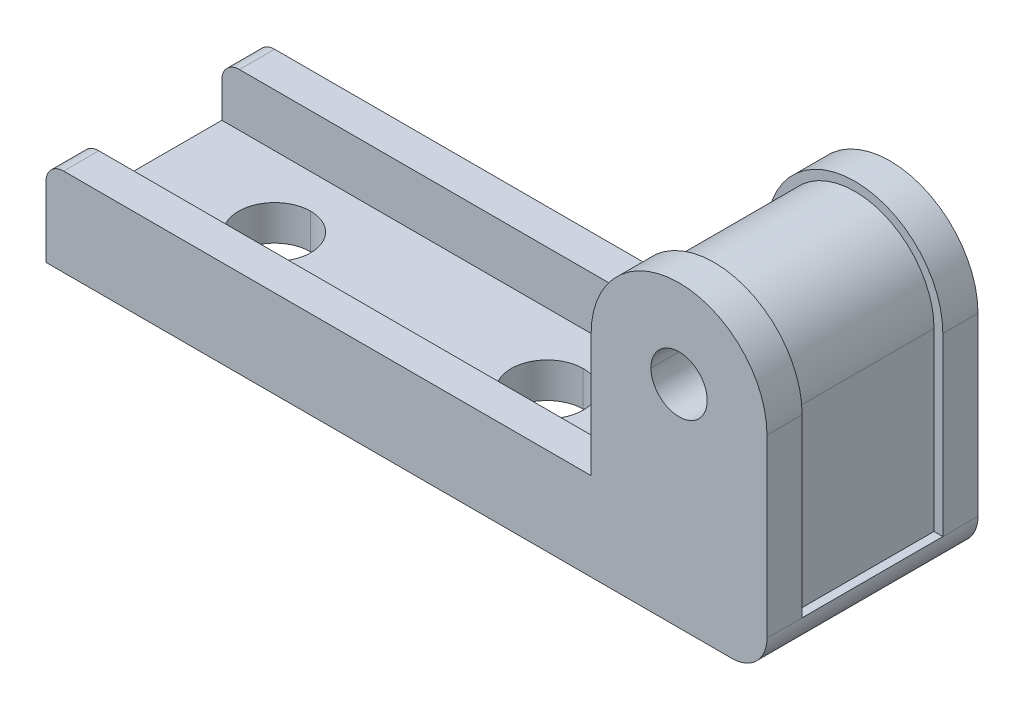
ISO-10303-21;
HEADER;
FILE_DESCRIPTION(('STEP AP214'),'2;1');
FILE_NAME('part.step','',(''),(''),'','','');
FILE_SCHEMA(('AUTOMOTIVE_DESIGN { 1 0 10303 214 1 1 1 1 }'));
ENDSEC;
DATA;
#1=APPLICATION_CONTEXT('core data for automotive mechanical design processes');
#2=APPLICATION_PROTOCOL_DEFINITION('international standard','automotive_design',2000,#1);
#3=PRODUCT_CONTEXT('',#1,'mechanical');
#4=PRODUCT('Part','Part','',(#3));
#5=PRODUCT_RELATED_PRODUCT_CATEGORY('part','',(#4));
#6=PRODUCT_DEFINITION_FORMATION('','',#4);
#7=PRODUCT_DEFINITION_CONTEXT('part definition',#1,'design');
#8=PRODUCT_DEFINITION('design','',#6,#7);
#9=PRODUCT_DEFINITION_SHAPE('','',#8);
#10=(LENGTH_UNIT() NAMED_UNIT(*) SI_UNIT(.MILLI.,.METRE.));
#11=(NAMED_UNIT(*) PLANE_ANGLE_UNIT() SI_UNIT($,.RADIAN.));
#12=(NAMED_UNIT(*) SI_UNIT($,.STERADIAN.) SOLID_ANGLE_UNIT());
#13=UNCERTAINTY_MEASURE_WITH_UNIT(LENGTH_MEASURE(1.E-05),#10,'distance_accuracy_value','');
#14=(GEOMETRIC_REPRESENTATION_CONTEXT(3) GLOBAL_UNCERTAINTY_ASSIGNED_CONTEXT((#13)) GLOBAL_UNIT_ASSIGNED_CONTEXT((#10,
#11,#12)) REPRESENTATION_CONTEXT('',''));
#15=CARTESIAN_POINT('',(0.,0.,0.));
#16=DIRECTION('',(0.,0.,1.));
#17=DIRECTION('',(1.,0.,0.));
#18=AXIS2_PLACEMENT_3D('',#15,#16,#17);
#19=CARTESIAN_POINT('',(-35.0000000000007,-7.99999999999931,6.));
#20=DIRECTION('',(0.,0.,-1.));
#21=DIRECTION('',(0.707106781186164,-0.707106781186931,0.));
#22=AXIS2_PLACEMENT_3D('',#19,#20,#21);
#23=CYLINDRICAL_SURFACE('',#22,0.999999999999313);
#24=CARTESIAN_POINT('',(-35.0000000000007,-7.99999999999931,-4.));
#25=DIRECTION('',(0.,0.,1.));
#26=DIRECTION('',(1.,0.,0.));
#27=AXIS2_PLACEMENT_3D('',#24,#25,#26);
#28=CIRCLE('',#27,0.999999999999313);
#29=CARTESIAN_POINT('',(-35.,-7.,-4.));
#30=VERTEX_POINT('',#29);
#31=CARTESIAN_POINT('',(-36.,-8.,-4.));
#32=VERTEX_POINT('',#31);
#33=EDGE_CURVE('E10',#30,#32,#28,.T.);
#34=ORIENTED_EDGE('',*,*,#33,.F.);
#35=DIRECTION('',(0.,0.,-1.));
#36=VECTOR('',#35,1.);
#37=CARTESIAN_POINT('',(-35.,-7.,6.));
#38=LINE('',#37,#36);
#39=CARTESIAN_POINT('',(-35.,-7.,-6.));
#40=VERTEX_POINT('',#39);
#41=EDGE_CURVE('E24',#30,#40,#38,.T.);
#42=ORIENTED_EDGE('',*,*,#41,.T.);
#43=CARTESIAN_POINT('',(-35.0000000000007,-7.99999999999931,-6.));
#44=DIRECTION('',(0.,0.,1.));
#45=DIRECTION('',(1.,0.,0.));
#46=AXIS2_PLACEMENT_3D('',#43,#44,#45);
#47=CIRCLE('',#46,0.999999999999313);
#48=CARTESIAN_POINT('',(-36.,-8.,-6.));
#49=VERTEX_POINT('',#48);
#50=EDGE_CURVE('E509',#40,#49,#47,.T.);
#51=ORIENTED_EDGE('',*,*,#50,.T.);
#52=DIRECTION('',(0.,0.,-1.));
#53=VECTOR('',#52,1.);
#54=CARTESIAN_POINT('',(-36.,-8.,6.));
#55=LINE('',#54,#53);
#56=EDGE_CURVE('E504',#32,#49,#55,.T.);
#57=ORIENTED_EDGE('',*,*,#56,.F.);
#58=EDGE_LOOP('',(#34,#42,#51,#57));
#59=FACE_BOUND('',#58,.T.);
#60=ADVANCED_FACE('F16',(#59),#23,.T.);
#61=CARTESIAN_POINT('',(-36.,-8.,6.));
#62=DIRECTION('',(1.,0.,0.));
#63=DIRECTION('',(0.,0.,-1.));
#64=AXIS2_PLACEMENT_3D('',#61,#62,#63);
#65=PLANE('',#64);
#66=DIRECTION('',(0.,0.,-1.));
#67=VECTOR('',#66,1.);
#68=CARTESIAN_POINT('',(-36.,-8.,6.));
#69=LINE('',#68,#67);
#70=CARTESIAN_POINT('',(-36.,-8.,6.));
#71=VERTEX_POINT('',#70);
#72=CARTESIAN_POINT('',(-36.,-8.,4.));
#73=VERTEX_POINT('',#72);
#74=EDGE_CURVE('E500',#71,#73,#69,.T.);
#75=ORIENTED_EDGE('',*,*,#74,.T.);
#76=DIRECTION('',(0.,-1.,0.));
#77=VECTOR('',#76,1.);
#78=CARTESIAN_POINT('',(-36.,-8.,4.));
#79=LINE('',#78,#77);
#80=CARTESIAN_POINT('',(-36.,-10.,4.));
#81=VERTEX_POINT('',#80);
#82=EDGE_CURVE('E496',#73,#81,#79,.T.);
#83=ORIENTED_EDGE('',*,*,#82,.T.);
#84=DIRECTION('',(0.,0.,1.));
#85=VECTOR('',#84,1.);
#86=CARTESIAN_POINT('',(-36.,-10.,6.));
#87=LINE('',#86,#85);
#88=CARTESIAN_POINT('',(-36.,-10.,-4.));
#89=VERTEX_POINT('',#88);
#90=EDGE_CURVE('E491',#89,#81,#87,.T.);
#91=ORIENTED_EDGE('',*,*,#90,.F.);
#92=DIRECTION('',(0.,-1.,0.));
#93=VECTOR('',#92,1.);
#94=CARTESIAN_POINT('',(-36.,-8.,-4.));
#95=LINE('',#94,#93);
#96=EDGE_CURVE('E486',#32,#89,#95,.T.);
#97=ORIENTED_EDGE('',*,*,#96,.F.);
#98=ORIENTED_EDGE('',*,*,#56,.T.);
#99=DIRECTION('',(0.,-1.,0.));
#100=VECTOR('',#99,1.);
#101=CARTESIAN_POINT('',(-36.,-8.,-6.));
#102=LINE('',#101,#100);
#103=CARTESIAN_POINT('',(-36.,-12.,-6.));
#104=VERTEX_POINT('',#103);
#105=EDGE_CURVE('E482',#49,#104,#102,.T.);
#106=ORIENTED_EDGE('',*,*,#105,.T.);
#107=DIRECTION('',(0.,0.,-1.));
#108=VECTOR('',#107,1.);
#109=CARTESIAN_POINT('',(-36.,-12.,6.));
#110=LINE('',#109,#108);
#111=CARTESIAN_POINT('',(-36.,-12.,6.));
#112=VERTEX_POINT('',#111);
#113=EDGE_CURVE('E477',#112,#104,#110,.T.);
#114=ORIENTED_EDGE('',*,*,#113,.F.);
#115=DIRECTION('',(0.,-1.,0.));
#116=VECTOR('',#115,1.);
#117=CARTESIAN_POINT('',(-36.,-8.,6.));
#118=LINE('',#117,#116);
#119=EDGE_CURVE('E472',#71,#112,#118,.T.);
#120=ORIENTED_EDGE('',*,*,#119,.F.);
#121=EDGE_LOOP('',(#75,#83,#91,#97,#98,#106,#114,#120));
#122=FACE_BOUND('',#121,.T.);
#123=ADVANCED_FACE('F525',(#122),#65,.F.);
#124=CARTESIAN_POINT('',(-35.0000000000007,-7.99999999999931,6.));
#125=DIRECTION('',(0.,0.,1.));
#126=DIRECTION('',(1.,0.,0.));
#127=AXIS2_PLACEMENT_3D('',#124,#125,#126);
#128=PLANE('',#127);
#129=CARTESIAN_POINT('',(0.,0.,6.));
#130=DIRECTION('',(0.,0.,1.));
#131=DIRECTION('',(1.,0.,0.));
#132=AXIS2_PLACEMENT_3D('',#129,#130,#131);
#133=CIRCLE('',#132,1.6);
#134=CARTESIAN_POINT('',(-1.6,0.,6.));
#135=VERTEX_POINT('',#134);
#136=CARTESIAN_POINT('',(1.6,0.,6.));
#137=VERTEX_POINT('',#136);
#138=EDGE_CURVE('E467',#135,#137,#133,.T.);
#139=ORIENTED_EDGE('',*,*,#138,.F.);
#140=CARTESIAN_POINT('',(0.,0.,6.));
#141=DIRECTION('',(0.,0.,1.));
#142=DIRECTION('',(1.,0.,0.));
#143=AXIS2_PLACEMENT_3D('',#140,#141,#142);
#144=CIRCLE('',#143,1.6);
#145=EDGE_CURVE('E462',#137,#135,#144,.T.);
#146=ORIENTED_EDGE('',*,*,#145,.F.);
#147=EDGE_LOOP('',(#139,#146));
#148=FACE_BOUND('',#147,.T.);
#149=CARTESIAN_POINT('',(-35.0000000000007,-7.99999999999931,6.));
#150=DIRECTION('',(0.,0.,1.));
#151=DIRECTION('',(1.,0.,0.));
#152=AXIS2_PLACEMENT_3D('',#149,#150,#151);
#153=CIRCLE('',#152,0.999999999999313);
#154=CARTESIAN_POINT('',(-35.,-7.,6.));
#155=VERTEX_POINT('',#154);
#156=EDGE_CURVE('E457',#155,#71,#153,.T.);
#157=ORIENTED_EDGE('',*,*,#156,.T.);
#158=ORIENTED_EDGE('',*,*,#119,.T.);
#159=DIRECTION('',(1.,0.,0.));
#160=VECTOR('',#159,1.);
#161=CARTESIAN_POINT('',(-36.,-12.,6.));
#162=LINE('',#161,#160);
#163=CARTESIAN_POINT('',(3.,-12.,6.));
#164=VERTEX_POINT('',#163);
#165=EDGE_CURVE('E453',#112,#164,#162,.T.);
#166=ORIENTED_EDGE('',*,*,#165,.T.);
#167=CARTESIAN_POINT('',(2.99999999999985,-9.99999999999985,6.));
#168=DIRECTION('',(0.,0.,1.));
#169=DIRECTION('',(1.,0.,0.));
#170=AXIS2_PLACEMENT_3D('',#167,#168,#169);
#171=CIRCLE('',#170,2.00000000000015);
#172=CARTESIAN_POINT('',(5.,-10.,6.));
#173=VERTEX_POINT('',#172);
#174=EDGE_CURVE('E449',#164,#173,#171,.T.);
#175=ORIENTED_EDGE('',*,*,#174,.T.);
#176=DIRECTION('',(0.,1.,0.));
#177=VECTOR('',#176,1.);
#178=CARTESIAN_POINT('',(5.,-10.,6.));
#179=LINE('',#178,#177);
#180=CARTESIAN_POINT('',(5.,0.,6.));
#181=VERTEX_POINT('',#180);
#182=EDGE_CURVE('E445',#173,#181,#179,.T.);
#183=ORIENTED_EDGE('',*,*,#182,.T.);
#184=CARTESIAN_POINT('',(0.,0.,6.));
#185=DIRECTION('',(0.,0.,1.));
#186=DIRECTION('',(1.,0.,0.));
#187=AXIS2_PLACEMENT_3D('',#184,#185,#186);
#188=CIRCLE('',#187,5.);
#189=CARTESIAN_POINT('',(-5.,0.,6.));
#190=VERTEX_POINT('',#189);
#191=EDGE_CURVE('E441',#181,#190,#188,.T.);
#192=ORIENTED_EDGE('',*,*,#191,.T.);
#193=DIRECTION('',(0.,-1.,0.));
#194=VECTOR('',#193,1.);
#195=CARTESIAN_POINT('',(-5.,0.,6.));
#196=LINE('',#195,#194);
#197=CARTESIAN_POINT('',(-5.,-7.,6.));
#198=VERTEX_POINT('',#197);
#199=EDGE_CURVE('E437',#190,#198,#196,.T.);
#200=ORIENTED_EDGE('',*,*,#199,.T.);
#201=DIRECTION('',(-1.,0.,0.));
#202=VECTOR('',#201,1.);
#203=CARTESIAN_POINT('',(-5.,-7.,6.));
#204=LINE('',#203,#202);
#205=EDGE_CURVE('E433',#198,#155,#204,.T.);
#206=ORIENTED_EDGE('',*,*,#205,.T.);
#207=EDGE_LOOP('',(#157,#158,#166,#175,#183,#192,#200,#206));
#208=FACE_BOUND('',#207,.T.);
#209=ADVANCED_FACE('F555',(#148,#208),#128,.T.);
#210=CARTESIAN_POINT('',(-5.,-7.,6.));
#211=DIRECTION('',(0.,-1.,0.));
#212=DIRECTION('',(0.,0.,-1.));
#213=AXIS2_PLACEMENT_3D('',#210,#211,#212);
#214=PLANE('',#213);
#215=DIRECTION('',(0.,0.,-1.));
#216=VECTOR('',#215,1.);
#217=CARTESIAN_POINT('',(-5.,-7.,6.));
#218=LINE('',#217,#216);
#219=CARTESIAN_POINT('',(-5.,-7.,4.));
#220=VERTEX_POINT('',#219);
#221=EDGE_CURVE('E429',#198,#220,#218,.T.);
#222=ORIENTED_EDGE('',*,*,#221,.T.);
#223=DIRECTION('',(-1.,0.,0.));
#224=VECTOR('',#223,1.);
#225=CARTESIAN_POINT('',(-5.,-7.,4.));
#226=LINE('',#225,#224);
#227=CARTESIAN_POINT('',(-35.,-7.,4.));
#228=VERTEX_POINT('',#227);
#229=EDGE_CURVE('E425',#220,#228,#226,.T.);
#230=ORIENTED_EDGE('',*,*,#229,.T.);
#231=DIRECTION('',(0.,0.,-1.));
#232=VECTOR('',#231,1.);
#233=CARTESIAN_POINT('',(-35.,-7.,6.));
#234=LINE('',#233,#232);
#235=EDGE_CURVE('E420',#155,#228,#234,.T.);
#236=ORIENTED_EDGE('',*,*,#235,.F.);
#237=ORIENTED_EDGE('',*,*,#205,.F.);
#238=EDGE_LOOP('',(#222,#230,#236,#237));
#239=FACE_BOUND('',#238,.T.);
#240=ADVANCED_FACE('F597',(#239),#214,.F.);
#241=CARTESIAN_POINT('',(-35.0000000000007,-7.99999999999931,6.));
#242=DIRECTION('',(0.,0.,-1.));
#243=DIRECTION('',(0.707106781186164,-0.707106781186931,0.));
#244=AXIS2_PLACEMENT_3D('',#241,#242,#243);
#245=CYLINDRICAL_SURFACE('',#244,0.999999999999313);
#246=ORIENTED_EDGE('',*,*,#235,.T.);
#247=CARTESIAN_POINT('',(-35.0000000000007,-7.99999999999931,4.));
#248=DIRECTION('',(0.,0.,1.));
#249=DIRECTION('',(1.,0.,0.));
#250=AXIS2_PLACEMENT_3D('',#247,#248,#249);
#251=CIRCLE('',#250,0.999999999999313);
#252=EDGE_CURVE('E415',#228,#73,#251,.T.);
#253=ORIENTED_EDGE('',*,*,#252,.T.);
#254=ORIENTED_EDGE('',*,*,#74,.F.);
#255=ORIENTED_EDGE('',*,*,#156,.F.);
#256=EDGE_LOOP('',(#246,#253,#254,#255));
#257=FACE_BOUND('',#256,.T.);
#258=ADVANCED_FACE('F559',(#257),#245,.T.);
#259=CARTESIAN_POINT('',(0.,0.,4.));
#260=DIRECTION('',(0.,0.,1.));
#261=DIRECTION('',(1.,0.,0.));
#262=AXIS2_PLACEMENT_3D('',#259,#260,#261);
#263=PLANE('',#262);
#264=ORIENTED_EDGE('',*,*,#252,.F.);
#265=ORIENTED_EDGE('',*,*,#229,.F.);
#266=DIRECTION('',(0.,-1.,0.));
#267=VECTOR('',#266,1.);
#268=CARTESIAN_POINT('',(-5.,0.,4.));
#269=LINE('',#268,#267);
#270=CARTESIAN_POINT('',(-5.,0.,4.));
#271=VERTEX_POINT('',#270);
#272=EDGE_CURVE('E410',#271,#220,#269,.T.);
#273=ORIENTED_EDGE('',*,*,#272,.F.);
#274=CARTESIAN_POINT('',(0.,0.,4.));
#275=DIRECTION('',(0.,0.,1.));
#276=DIRECTION('',(1.,0.,0.));
#277=AXIS2_PLACEMENT_3D('',#274,#275,#276);
#278=CIRCLE('',#277,5.);
#279=CARTESIAN_POINT('',(5.,0.,4.));
#280=VERTEX_POINT('',#279);
#281=EDGE_CURVE('E405',#280,#271,#278,.T.);
#282=ORIENTED_EDGE('',*,*,#281,.F.);
#283=DIRECTION('',(0.,1.,0.));
#284=VECTOR('',#283,1.);
#285=CARTESIAN_POINT('',(5.,-10.,4.));
#286=LINE('',#285,#284);
#287=CARTESIAN_POINT('',(5.,-10.,4.));
#288=VERTEX_POINT('',#287);
#289=EDGE_CURVE('E400',#288,#280,#286,.T.);
#290=ORIENTED_EDGE('',*,*,#289,.F.);
#291=DIRECTION('',(1.,0.,0.));
#292=VECTOR('',#291,1.);
#293=CARTESIAN_POINT('',(4.5,-10.,4.));
#294=LINE('',#293,#292);
#295=CARTESIAN_POINT('',(4.5,-10.,4.));
#296=VERTEX_POINT('',#295);
#297=EDGE_CURVE('E395',#296,#288,#294,.T.);
#298=ORIENTED_EDGE('',*,*,#297,.F.);
#299=DIRECTION('',(0.,-1.,0.));
#300=VECTOR('',#299,1.);
#301=CARTESIAN_POINT('',(4.5,0.,4.));
#302=LINE('',#301,#300);
#303=CARTESIAN_POINT('',(4.5,0.,4.));
#304=VERTEX_POINT('',#303);
#305=EDGE_CURVE('E390',#304,#296,#302,.T.);
#306=ORIENTED_EDGE('',*,*,#305,.F.);
#307=CARTESIAN_POINT('',(0.,0.,4.));
#308=DIRECTION('',(0.,0.,1.));
#309=DIRECTION('',(1.,0.,0.));
#310=AXIS2_PLACEMENT_3D('',#307,#308,#309);
#311=CIRCLE('',#310,4.5);
#312=CARTESIAN_POINT('',(-4.5,0.,4.));
#313=VERTEX_POINT('',#312);
#314=EDGE_CURVE('E386',#304,#313,#311,.T.);
#315=ORIENTED_EDGE('',*,*,#314,.T.);
#316=DIRECTION('',(0.,1.,0.));
#317=VECTOR('',#316,1.);
#318=CARTESIAN_POINT('',(-4.5,-10.,4.));
#319=LINE('',#318,#317);
#320=CARTESIAN_POINT('',(-4.5,-10.,4.));
#321=VERTEX_POINT('',#320);
#322=EDGE_CURVE('E381',#321,#313,#319,.T.);
#323=ORIENTED_EDGE('',*,*,#322,.F.);
#324=DIRECTION('',(1.,0.,0.));
#325=VECTOR('',#324,1.);
#326=CARTESIAN_POINT('',(-44.5,-10.,4.));
#327=LINE('',#326,#325);
#328=EDGE_CURVE('E376',#81,#321,#327,.T.);
#329=ORIENTED_EDGE('',*,*,#328,.F.);
#330=ORIENTED_EDGE('',*,*,#82,.F.);
#331=EDGE_LOOP('',(#264,#265,#273,#282,#290,#298,#306,#315,#323,#329,#330));
#332=FACE_BOUND('',#331,.T.);
#333=ADVANCED_FACE('F565',(#332),#263,.F.);
#334=CARTESIAN_POINT('',(-44.5,-10.,4.));
#335=DIRECTION('',(0.,1.,0.));
#336=DIRECTION('',(0.,0.,1.));
#337=AXIS2_PLACEMENT_3D('',#334,#335,#336);
#338=PLANE('',#337);
#339=CARTESIAN_POINT('',(-29.,-10.,0.));
#340=DIRECTION('',(0.,1.,0.));
#341=DIRECTION('',(1.,0.,0.));
#342=AXIS2_PLACEMENT_3D('',#339,#340,#341);
#343=CIRCLE('',#342,2.05);
#344=CARTESIAN_POINT('',(-29.,-10.,-2.05));
#345=VERTEX_POINT('',#344);
#346=CARTESIAN_POINT('',(-29.,-10.,2.05));
#347=VERTEX_POINT('',#346);
#348=EDGE_CURVE('E371',#345,#347,#343,.T.);
#349=ORIENTED_EDGE('',*,*,#348,.F.);
#350=CARTESIAN_POINT('',(-29.,-10.,0.));
#351=DIRECTION('',(0.,1.,0.));
#352=DIRECTION('',(0.,0.,1.));
#353=AXIS2_PLACEMENT_3D('',#350,#351,#352);
#354=CIRCLE('',#353,2.05);
#355=EDGE_CURVE('E366',#347,#345,#354,.T.);
#356=ORIENTED_EDGE('',*,*,#355,.F.);
#357=EDGE_LOOP('',(#349,#356));
#358=FACE_BOUND('',#357,.T.);
#359=CARTESIAN_POINT('',(-13.5,-10.,0.));
#360=DIRECTION('',(0.,1.,0.));
#361=DIRECTION('',(1.,0.,0.));
#362=AXIS2_PLACEMENT_3D('',#359,#360,#361);
#363=CIRCLE('',#362,2.05);
#364=CARTESIAN_POINT('',(-13.5,-10.,-2.05));
#365=VERTEX_POINT('',#364);
#366=CARTESIAN_POINT('',(-13.5,-10.,2.05));
#367=VERTEX_POINT('',#366);
#368=EDGE_CURVE('E362',#365,#367,#363,.T.);
#369=ORIENTED_EDGE('',*,*,#368,.F.);
#370=CARTESIAN_POINT('',(-13.5,-10.,0.));
#371=DIRECTION('',(0.,1.,0.));
#372=DIRECTION('',(0.,0.,1.));
#373=AXIS2_PLACEMENT_3D('',#370,#371,#372);
#374=CIRCLE('',#373,2.05);
#375=EDGE_CURVE('E198',#367,#365,#374,.T.);
#376=ORIENTED_EDGE('',*,*,#375,.F.);
#377=EDGE_LOOP('',(#369,#376));
#378=FACE_BOUND('',#377,.T.);
#379=ORIENTED_EDGE('',*,*,#90,.T.);
#380=ORIENTED_EDGE('',*,*,#328,.T.);
#381=DIRECTION('',(0.,0.,-1.));
#382=VECTOR('',#381,1.);
#383=CARTESIAN_POINT('',(-4.5,-10.,4.));
#384=LINE('',#383,#382);
#385=CARTESIAN_POINT('',(-4.5,-10.,-4.));
#386=VERTEX_POINT('',#385);
#387=EDGE_CURVE('E355',#321,#386,#384,.T.);
#388=ORIENTED_EDGE('',*,*,#387,.T.);
#389=DIRECTION('',(1.,0.,0.));
#390=VECTOR('',#389,1.);
#391=CARTESIAN_POINT('',(-44.5,-10.,-4.));
#392=LINE('',#391,#390);
#393=EDGE_CURVE('E350',#89,#386,#392,.T.);
#394=ORIENTED_EDGE('',*,*,#393,.F.);
#395=EDGE_LOOP('',(#379,#380,#388,#394));
#396=FACE_BOUND('',#395,.T.);
#397=ADVANCED_FACE('F568',(#358,#378,#396),#338,.T.);
#398=CARTESIAN_POINT('',(0.,0.,-4.));
#399=DIRECTION('',(0.,0.,1.));
#400=DIRECTION('',(1.,0.,0.));
#401=AXIS2_PLACEMENT_3D('',#398,#399,#400);
#402=PLANE('',#401);
#403=ORIENTED_EDGE('',*,*,#96,.T.);
#404=ORIENTED_EDGE('',*,*,#393,.T.);
#405=DIRECTION('',(0.,1.,0.));
#406=VECTOR('',#405,1.);
#407=CARTESIAN_POINT('',(-4.5,-10.,-4.));
#408=LINE('',#407,#406);
#409=CARTESIAN_POINT('',(-4.5,0.,-4.));
#410=VERTEX_POINT('',#409);
#411=EDGE_CURVE('E346',#386,#410,#408,.T.);
#412=ORIENTED_EDGE('',*,*,#411,.T.);
#413=CARTESIAN_POINT('',(0.,0.,-4.));
#414=DIRECTION('',(0.,0.,1.));
#415=DIRECTION('',(1.,0.,0.));
#416=AXIS2_PLACEMENT_3D('',#413,#414,#415);
#417=CIRCLE('',#416,4.5);
#418=CARTESIAN_POINT('',(4.5,0.,-4.));
#419=VERTEX_POINT('',#418);
#420=EDGE_CURVE('E341',#419,#410,#417,.T.);
#421=ORIENTED_EDGE('',*,*,#420,.F.);
#422=DIRECTION('',(0.,-1.,0.));
#423=VECTOR('',#422,1.);
#424=CARTESIAN_POINT('',(4.5,0.,-4.));
#425=LINE('',#424,#423);
#426=CARTESIAN_POINT('',(4.5,-10.,-4.));
#427=VERTEX_POINT('',#426);
#428=EDGE_CURVE('E337',#419,#427,#425,.T.);
#429=ORIENTED_EDGE('',*,*,#428,.T.);
#430=DIRECTION('',(1.,0.,0.));
#431=VECTOR('',#430,1.);
#432=CARTESIAN_POINT('',(4.5,-10.,-4.));
#433=LINE('',#432,#431);
#434=CARTESIAN_POINT('',(5.,-10.,-4.));
#435=VERTEX_POINT('',#434);
#436=EDGE_CURVE('E333',#427,#435,#433,.T.);
#437=ORIENTED_EDGE('',*,*,#436,.T.);
#438=DIRECTION('',(0.,1.,0.));
#439=VECTOR('',#438,1.);
#440=CARTESIAN_POINT('',(5.,-10.,-4.));
#441=LINE('',#440,#439);
#442=CARTESIAN_POINT('',(5.,0.,-4.));
#443=VERTEX_POINT('',#442);
#444=EDGE_CURVE('E329',#435,#443,#441,.T.);
#445=ORIENTED_EDGE('',*,*,#444,.T.);
#446=CARTESIAN_POINT('',(0.,0.,-4.));
#447=DIRECTION('',(0.,0.,1.));
#448=DIRECTION('',(1.,0.,0.));
#449=AXIS2_PLACEMENT_3D('',#446,#447,#448);
#450=CIRCLE('',#449,5.);
#451=CARTESIAN_POINT('',(-5.,0.,-4.));
#452=VERTEX_POINT('',#451);
#453=EDGE_CURVE('E325',#443,#452,#450,.T.);
#454=ORIENTED_EDGE('',*,*,#453,.T.);
#455=DIRECTION('',(0.,-1.,0.));
#456=VECTOR('',#455,1.);
#457=CARTESIAN_POINT('',(-5.,0.,-4.));
#458=LINE('',#457,#456);
#459=CARTESIAN_POINT('',(-5.,-7.,-4.));
#460=VERTEX_POINT('',#459);
#461=EDGE_CURVE('E321',#452,#460,#458,.T.);
#462=ORIENTED_EDGE('',*,*,#461,.T.);
#463=DIRECTION('',(-1.,0.,0.));
#464=VECTOR('',#463,1.);
#465=CARTESIAN_POINT('',(-5.,-7.,-4.));
#466=LINE('',#465,#464);
#467=EDGE_CURVE('E316',#460,#30,#466,.T.);
#468=ORIENTED_EDGE('',*,*,#467,.T.);
#469=ORIENTED_EDGE('',*,*,#33,.T.);
#470=EDGE_LOOP('',(#403,#404,#412,#421,#429,#437,#445,#454,#462,#468,#469));
#471=FACE_BOUND('',#470,.T.);
#472=ADVANCED_FACE('F528',(#471),#402,.T.);
#473=CARTESIAN_POINT('',(-5.,-7.,6.));
#474=DIRECTION('',(0.,-1.,0.));
#475=DIRECTION('',(0.,0.,-1.));
#476=AXIS2_PLACEMENT_3D('',#473,#474,#475);
#477=PLANE('',#476);
#478=ORIENTED_EDGE('',*,*,#467,.F.);
#479=DIRECTION('',(0.,0.,-1.));
#480=VECTOR('',#479,1.);
#481=CARTESIAN_POINT('',(-5.,-7.,6.));
#482=LINE('',#481,#480);
#483=CARTESIAN_POINT('',(-5.,-7.,-6.));
#484=VERTEX_POINT('',#483);
#485=EDGE_CURVE('E312',#460,#484,#482,.T.);
#486=ORIENTED_EDGE('',*,*,#485,.T.);
#487=DIRECTION('',(-1.,0.,0.));
#488=VECTOR('',#487,1.);
#489=CARTESIAN_POINT('',(-5.,-7.,-6.));
#490=LINE('',#489,#488);
#491=EDGE_CURVE('E308',#484,#40,#490,.T.);
#492=ORIENTED_EDGE('',*,*,#491,.T.);
#493=ORIENTED_EDGE('',*,*,#41,.F.);
#494=EDGE_LOOP('',(#478,#486,#492,#493));
#495=FACE_BOUND('',#494,.T.);
#496=ADVANCED_FACE('F533',(#495),#477,.F.);
#497=CARTESIAN_POINT('',(-35.0000000000007,-7.99999999999931,-6.));
#498=DIRECTION('',(0.,0.,1.));
#499=DIRECTION('',(1.,0.,0.));
#500=AXIS2_PLACEMENT_3D('',#497,#498,#499);
#501=PLANE('',#500);
#502=CARTESIAN_POINT('',(0.,0.,-6.));
#503=DIRECTION('',(0.,0.,1.));
#504=DIRECTION('',(1.,0.,0.));
#505=AXIS2_PLACEMENT_3D('',#502,#503,#504);
#506=CIRCLE('',#505,1.6);
#507=CARTESIAN_POINT('',(1.6,0.,-6.));
#508=VERTEX_POINT('',#507);
#509=CARTESIAN_POINT('',(-1.6,0.,-6.));
#510=VERTEX_POINT('',#509);
#511=EDGE_CURVE('E304',#508,#510,#506,.T.);
#512=ORIENTED_EDGE('',*,*,#511,.T.);
#513=CARTESIAN_POINT('',(0.,0.,-6.));
#514=DIRECTION('',(0.,0.,1.));
#515=DIRECTION('',(1.,0.,0.));
#516=AXIS2_PLACEMENT_3D('',#513,#514,#515);
#517=CIRCLE('',#516,1.6);
#518=EDGE_CURVE('E300',#510,#508,#517,.T.);
#519=ORIENTED_EDGE('',*,*,#518,.T.);
#520=EDGE_LOOP('',(#512,#519));
#521=FACE_BOUND('',#520,.T.);
#522=ORIENTED_EDGE('',*,*,#50,.F.);
#523=ORIENTED_EDGE('',*,*,#491,.F.);
#524=DIRECTION('',(0.,-1.,0.));
#525=VECTOR('',#524,1.);
#526=CARTESIAN_POINT('',(-5.,0.,-6.));
#527=LINE('',#526,#525);
#528=CARTESIAN_POINT('',(-5.,0.,-6.));
#529=VERTEX_POINT('',#528);
#530=EDGE_CURVE('E295',#529,#484,#527,.T.);
#531=ORIENTED_EDGE('',*,*,#530,.F.);
#532=CARTESIAN_POINT('',(0.,0.,-6.));
#533=DIRECTION('',(0.,0.,1.));
#534=DIRECTION('',(1.,0.,0.));
#535=AXIS2_PLACEMENT_3D('',#532,#533,#534);
#536=CIRCLE('',#535,5.);
#537=CARTESIAN_POINT('',(5.,0.,-6.));
#538=VERTEX_POINT('',#537);
#539=EDGE_CURVE('E290',#538,#529,#536,.T.);
#540=ORIENTED_EDGE('',*,*,#539,.F.);
#541=DIRECTION('',(0.,1.,0.));
#542=VECTOR('',#541,1.);
#543=CARTESIAN_POINT('',(5.,-10.,-6.));
#544=LINE('',#543,#542);
#545=CARTESIAN_POINT('',(5.,-10.,-6.));
#546=VERTEX_POINT('',#545);
#547=EDGE_CURVE('E285',#546,#538,#544,.T.);
#548=ORIENTED_EDGE('',*,*,#547,.F.);
#549=CARTESIAN_POINT('',(2.99999999999985,-9.99999999999985,-6.));
#550=DIRECTION('',(0.,0.,1.));
#551=DIRECTION('',(1.,0.,0.));
#552=AXIS2_PLACEMENT_3D('',#549,#550,#551);
#553=CIRCLE('',#552,2.00000000000015);
#554=CARTESIAN_POINT('',(3.,-12.,-6.));
#555=VERTEX_POINT('',#554);
#556=EDGE_CURVE('E280',#555,#546,#553,.T.);
#557=ORIENTED_EDGE('',*,*,#556,.F.);
#558=DIRECTION('',(1.,0.,0.));
#559=VECTOR('',#558,1.);
#560=CARTESIAN_POINT('',(-36.,-12.,-6.));
#561=LINE('',#560,#559);
#562=EDGE_CURVE('E275',#104,#555,#561,.T.);
#563=ORIENTED_EDGE('',*,*,#562,.F.);
#564=ORIENTED_EDGE('',*,*,#105,.F.);
#565=EDGE_LOOP('',(#522,#523,#531,#540,#548,#557,#563,#564));
#566=FACE_BOUND('',#565,.T.);
#567=ADVANCED_FACE('F523',(#521,#566),#501,.F.);
#568=CARTESIAN_POINT('',(-36.,-12.,6.));
#569=DIRECTION('',(0.,1.,0.));
#570=DIRECTION('',(0.,0.,1.));
#571=AXIS2_PLACEMENT_3D('',#568,#569,#570);
#572=PLANE('',#571);
#573=CARTESIAN_POINT('',(-29.,-12.,0.));
#574=DIRECTION('',(0.,1.,0.));
#575=DIRECTION('',(1.,0.,0.));
#576=AXIS2_PLACEMENT_3D('',#573,#574,#575);
#577=CIRCLE('',#576,2.05);
#578=CARTESIAN_POINT('',(-29.,-12.,-2.05));
#579=VERTEX_POINT('',#578);
#580=CARTESIAN_POINT('',(-29.,-12.,2.05));
#581=VERTEX_POINT('',#580);
#582=EDGE_CURVE('E271',#579,#581,#577,.T.);
#583=ORIENTED_EDGE('',*,*,#582,.T.);
#584=CARTESIAN_POINT('',(-29.,-12.,0.));
#585=DIRECTION('',(0.,1.,0.));
#586=DIRECTION('',(0.,0.,1.));
#587=AXIS2_PLACEMENT_3D('',#584,#585,#586);
#588=CIRCLE('',#587,2.05);
#589=EDGE_CURVE('E195',#581,#579,#588,.T.);
#590=ORIENTED_EDGE('',*,*,#589,.T.);
#591=EDGE_LOOP('',(#583,#590));
#592=FACE_BOUND('',#591,.T.);
#593=CARTESIAN_POINT('',(-13.5,-12.,0.));
#594=DIRECTION('',(0.,1.,0.));
#595=DIRECTION('',(1.,0.,0.));
#596=AXIS2_PLACEMENT_3D('',#593,#594,#595);
#597=CIRCLE('',#596,2.05);
#598=CARTESIAN_POINT('',(-13.5,-12.,-2.05));
#599=VERTEX_POINT('',#598);
#600=CARTESIAN_POINT('',(-13.5,-12.,2.05));
#601=VERTEX_POINT('',#600);
#602=EDGE_CURVE('E181',#599,#601,#597,.T.);
#603=ORIENTED_EDGE('',*,*,#602,.T.);
#604=CARTESIAN_POINT('',(-13.5,-12.,0.));
#605=DIRECTION('',(0.,1.,0.));
#606=DIRECTION('',(0.,0.,1.));
#607=AXIS2_PLACEMENT_3D('',#604,#605,#606);
#608=CIRCLE('',#607,2.05);
#609=EDGE_CURVE('E177',#601,#599,#608,.T.);
#610=ORIENTED_EDGE('',*,*,#609,.T.);
#611=EDGE_LOOP('',(#603,#610));
#612=FACE_BOUND('',#611,.T.);
#613=ORIENTED_EDGE('',*,*,#562,.T.);
#614=DIRECTION('',(0.,0.,-1.));
#615=VECTOR('',#614,1.);
#616=CARTESIAN_POINT('',(3.,-12.,6.));
#617=LINE('',#616,#615);
#618=EDGE_CURVE('E186',#164,#555,#617,.T.);
#619=ORIENTED_EDGE('',*,*,#618,.F.);
#620=ORIENTED_EDGE('',*,*,#165,.F.);
#621=ORIENTED_EDGE('',*,*,#113,.T.);
#622=EDGE_LOOP('',(#613,#619,#620,#621));
#623=FACE_BOUND('',#622,.T.);
#624=ADVANCED_FACE('F179',(#592,#612,#623),#572,.F.);
#625=CARTESIAN_POINT('',(2.99999999999985,-9.99999999999985,6.));
#626=DIRECTION('',(0.,0.,-1.));
#627=DIRECTION('',(-0.707106781186575,0.70710678118652,0.));
#628=AXIS2_PLACEMENT_3D('',#625,#626,#627);
#629=CYLINDRICAL_SURFACE('',#628,2.00000000000015);
#630=ORIENTED_EDGE('',*,*,#556,.T.);
#631=DIRECTION('',(0.,0.,-1.));
#632=VECTOR('',#631,1.);
#633=CARTESIAN_POINT('',(5.,-10.,6.));
#634=LINE('',#633,#632);
#635=EDGE_CURVE('E255',#435,#546,#634,.T.);
#636=ORIENTED_EDGE('',*,*,#635,.F.);
#637=DIRECTION('',(0.,0.,-1.));
#638=VECTOR('',#637,1.);
#639=CARTESIAN_POINT('',(5.,-10.,6.));
#640=LINE('',#639,#638);
#641=EDGE_CURVE('E250',#288,#435,#640,.T.);
#642=ORIENTED_EDGE('',*,*,#641,.F.);
#643=DIRECTION('',(0.,0.,-1.));
#644=VECTOR('',#643,1.);
#645=CARTESIAN_POINT('',(5.,-10.,6.));
#646=LINE('',#645,#644);
#647=EDGE_CURVE('E245',#173,#288,#646,.T.);
#648=ORIENTED_EDGE('',*,*,#647,.F.);
#649=ORIENTED_EDGE('',*,*,#174,.F.);
#650=ORIENTED_EDGE('',*,*,#618,.T.);
#651=EDGE_LOOP('',(#630,#636,#642,#648,#649,#650));
#652=FACE_BOUND('',#651,.T.);
#653=ADVANCED_FACE('F547',(#652),#629,.T.);
#654=CARTESIAN_POINT('',(5.,-10.,6.));
#655=DIRECTION('',(-1.,0.,0.));
#656=DIRECTION('',(0.,0.,1.));
#657=AXIS2_PLACEMENT_3D('',#654,#655,#656);
#658=PLANE('',#657);
#659=ORIENTED_EDGE('',*,*,#647,.T.);
#660=ORIENTED_EDGE('',*,*,#289,.T.);
#661=DIRECTION('',(0.,0.,-1.));
#662=VECTOR('',#661,1.);
#663=CARTESIAN_POINT('',(5.,0.,6.));
#664=LINE('',#663,#662);
#665=EDGE_CURVE('E240',#181,#280,#664,.T.);
#666=ORIENTED_EDGE('',*,*,#665,.F.);
#667=ORIENTED_EDGE('',*,*,#182,.F.);
#668=EDGE_LOOP('',(#659,#660,#666,#667));
#669=FACE_BOUND('',#668,.T.);
#670=ADVANCED_FACE('F587',(#669),#658,.F.);
#671=CARTESIAN_POINT('',(0.,0.,6.));
#672=DIRECTION('',(0.,0.,-1.));
#673=DIRECTION('',(0.,-1.,0.));
#674=AXIS2_PLACEMENT_3D('',#671,#672,#673);
#675=CYLINDRICAL_SURFACE('',#674,5.);
#676=ORIENTED_EDGE('',*,*,#665,.T.);
#677=ORIENTED_EDGE('',*,*,#281,.T.);
#678=DIRECTION('',(0.,0.,-1.));
#679=VECTOR('',#678,1.);
#680=CARTESIAN_POINT('',(-5.,0.,6.));
#681=LINE('',#680,#679);
#682=EDGE_CURVE('E235',#190,#271,#681,.T.);
#683=ORIENTED_EDGE('',*,*,#682,.F.);
#684=ORIENTED_EDGE('',*,*,#191,.F.);
#685=EDGE_LOOP('',(#676,#677,#683,#684));
#686=FACE_BOUND('',#685,.T.);
#687=ADVANCED_FACE('F595',(#686),#675,.T.);
#688=CARTESIAN_POINT('',(-5.,0.,6.));
#689=DIRECTION('',(1.,0.,0.));
#690=DIRECTION('',(0.,0.,-1.));
#691=AXIS2_PLACEMENT_3D('',#688,#689,#690);
#692=PLANE('',#691);
#693=ORIENTED_EDGE('',*,*,#682,.T.);
#694=ORIENTED_EDGE('',*,*,#272,.T.);
#695=ORIENTED_EDGE('',*,*,#221,.F.);
#696=ORIENTED_EDGE('',*,*,#199,.F.);
#697=EDGE_LOOP('',(#693,#694,#695,#696));
#698=FACE_BOUND('',#697,.T.);
#699=ADVANCED_FACE('F594',(#698),#692,.F.);
#700=CARTESIAN_POINT('',(4.5,-10.,4.));
#701=DIRECTION('',(0.,1.,0.));
#702=DIRECTION('',(0.,0.,1.));
#703=AXIS2_PLACEMENT_3D('',#700,#701,#702);
#704=PLANE('',#703);
#705=ORIENTED_EDGE('',*,*,#641,.T.);
#706=ORIENTED_EDGE('',*,*,#436,.F.);
#707=DIRECTION('',(0.,0.,-1.));
#708=VECTOR('',#707,1.);
#709=CARTESIAN_POINT('',(4.5,-10.,4.));
#710=LINE('',#709,#708);
#711=EDGE_CURVE('E230',#296,#427,#710,.T.);
#712=ORIENTED_EDGE('',*,*,#711,.F.);
#713=ORIENTED_EDGE('',*,*,#297,.T.);
#714=EDGE_LOOP('',(#705,#706,#712,#713));
#715=FACE_BOUND('',#714,.T.);
#716=ADVANCED_FACE('F583',(#715),#704,.T.);
#717=CARTESIAN_POINT('',(4.5,0.,4.));
#718=DIRECTION('',(1.,0.,0.));
#719=DIRECTION('',(0.,0.,-1.));
#720=AXIS2_PLACEMENT_3D('',#717,#718,#719);
#721=PLANE('',#720);
#722=ORIENTED_EDGE('',*,*,#428,.F.);
#723=DIRECTION('',(0.,0.,-1.));
#724=VECTOR('',#723,1.);
#725=CARTESIAN_POINT('',(4.5,0.,4.));
#726=LINE('',#725,#724);
#727=EDGE_CURVE('E225',#304,#419,#726,.T.);
#728=ORIENTED_EDGE('',*,*,#727,.F.);
#729=ORIENTED_EDGE('',*,*,#305,.T.);
#730=ORIENTED_EDGE('',*,*,#711,.T.);
#731=EDGE_LOOP('',(#722,#728,#729,#730));
#732=FACE_BOUND('',#731,.T.);
#733=ADVANCED_FACE('F579',(#732),#721,.T.);
#734=CARTESIAN_POINT('',(0.,0.,4.));
#735=DIRECTION('',(0.,0.,-1.));
#736=DIRECTION('',(0.,-1.,0.));
#737=AXIS2_PLACEMENT_3D('',#734,#735,#736);
#738=CYLINDRICAL_SURFACE('',#737,4.5);
#739=ORIENTED_EDGE('',*,*,#420,.T.);
#740=DIRECTION('',(0.,0.,-1.));
#741=VECTOR('',#740,1.);
#742=CARTESIAN_POINT('',(-4.5,0.,4.));
#743=LINE('',#742,#741);
#744=EDGE_CURVE('E220',#313,#410,#743,.T.);
#745=ORIENTED_EDGE('',*,*,#744,.F.);
#746=ORIENTED_EDGE('',*,*,#314,.F.);
#747=ORIENTED_EDGE('',*,*,#727,.T.);
#748=EDGE_LOOP('',(#739,#745,#746,#747));
#749=FACE_BOUND('',#748,.T.);
#750=ADVANCED_FACE('F575',(#749),#738,.T.);
#751=CARTESIAN_POINT('',(-4.5,-10.,4.));
#752=DIRECTION('',(-1.,0.,0.));
#753=DIRECTION('',(0.,0.,1.));
#754=AXIS2_PLACEMENT_3D('',#751,#752,#753);
#755=PLANE('',#754);
#756=ORIENTED_EDGE('',*,*,#411,.F.);
#757=ORIENTED_EDGE('',*,*,#387,.F.);
#758=ORIENTED_EDGE('',*,*,#322,.T.);
#759=ORIENTED_EDGE('',*,*,#744,.T.);
#760=EDGE_LOOP('',(#756,#757,#758,#759));
#761=FACE_BOUND('',#760,.T.);
#762=ADVANCED_FACE('F572',(#761),#755,.T.);
#763=CARTESIAN_POINT('',(5.,-10.,6.));
#764=DIRECTION('',(-1.,0.,0.));
#765=DIRECTION('',(0.,0.,1.));
#766=AXIS2_PLACEMENT_3D('',#763,#764,#765);
#767=PLANE('',#766);
#768=ORIENTED_EDGE('',*,*,#444,.F.);
#769=ORIENTED_EDGE('',*,*,#635,.T.);
#770=ORIENTED_EDGE('',*,*,#547,.T.);
#771=DIRECTION('',(0.,0.,-1.));
#772=VECTOR('',#771,1.);
#773=CARTESIAN_POINT('',(5.,0.,6.));
#774=LINE('',#773,#772);
#775=EDGE_CURVE('E215',#443,#538,#774,.T.);
#776=ORIENTED_EDGE('',*,*,#775,.F.);
#777=EDGE_LOOP('',(#768,#769,#770,#776));
#778=FACE_BOUND('',#777,.T.);
#779=ADVANCED_FACE('F543',(#778),#767,.F.);
#780=CARTESIAN_POINT('',(0.,0.,6.));
#781=DIRECTION('',(0.,0.,-1.));
#782=DIRECTION('',(0.,-1.,0.));
#783=AXIS2_PLACEMENT_3D('',#780,#781,#782);
#784=CYLINDRICAL_SURFACE('',#783,5.);
#785=ORIENTED_EDGE('',*,*,#453,.F.);
#786=ORIENTED_EDGE('',*,*,#775,.T.);
#787=ORIENTED_EDGE('',*,*,#539,.T.);
#788=DIRECTION('',(0.,0.,-1.));
#789=VECTOR('',#788,1.);
#790=CARTESIAN_POINT('',(-5.,0.,6.));
#791=LINE('',#790,#789);
#792=EDGE_CURVE('E201',#452,#529,#791,.T.);
#793=ORIENTED_EDGE('',*,*,#792,.F.);
#794=EDGE_LOOP('',(#785,#786,#787,#793));
#795=FACE_BOUND('',#794,.T.);
#796=ADVANCED_FACE('F540',(#795),#784,.T.);
#797=CARTESIAN_POINT('',(-5.,0.,6.));
#798=DIRECTION('',(1.,0.,0.));
#799=DIRECTION('',(0.,0.,-1.));
#800=AXIS2_PLACEMENT_3D('',#797,#798,#799);
#801=PLANE('',#800);
#802=ORIENTED_EDGE('',*,*,#461,.F.);
#803=ORIENTED_EDGE('',*,*,#792,.T.);
#804=ORIENTED_EDGE('',*,*,#530,.T.);
#805=ORIENTED_EDGE('',*,*,#485,.F.);
#806=EDGE_LOOP('',(#802,#803,#804,#805));
#807=FACE_BOUND('',#806,.T.);
#808=ADVANCED_FACE('F535',(#807),#801,.F.);
#809=CARTESIAN_POINT('',(-13.5,-10.,0.));
#810=DIRECTION('',(0.,-1.,0.));
#811=DIRECTION('',(-1.,0.,0.));
#812=AXIS2_PLACEMENT_3D('',#809,#810,#811);
#813=CYLINDRICAL_SURFACE('',#812,2.05);
#814=DIRECTION('',(0.,-1.,0.));
#815=VECTOR('',#814,1.);
#816=CARTESIAN_POINT('',(-13.5,-10.,2.05));
#817=LINE('',#816,#815);
#818=EDGE_CURVE('E194',#367,#601,#817,.T.);
#819=ORIENTED_EDGE('',*,*,#818,.F.);
#820=ORIENTED_EDGE('',*,*,#375,.T.);
#821=DIRECTION('',(0.,-1.,0.));
#822=VECTOR('',#821,1.);
#823=CARTESIAN_POINT('',(-13.5,-10.,-2.05));
#824=LINE('',#823,#822);
#825=EDGE_CURVE('E192',#365,#599,#824,.T.);
#826=ORIENTED_EDGE('',*,*,#825,.T.);
#827=ORIENTED_EDGE('',*,*,#609,.F.);
#828=EDGE_LOOP('',(#819,#820,#826,#827));
#829=FACE_BOUND('',#828,.T.);
#830=ADVANCED_FACE('F197',(#829),#813,.F.);
#831=CARTESIAN_POINT('',(-13.5,-10.,0.));
#832=DIRECTION('',(0.,-1.,0.));
#833=DIRECTION('',(1.,0.,0.));
#834=AXIS2_PLACEMENT_3D('',#831,#832,#833);
#835=CYLINDRICAL_SURFACE('',#834,2.05);
#836=ORIENTED_EDGE('',*,*,#818,.T.);
#837=ORIENTED_EDGE('',*,*,#602,.F.);
#838=ORIENTED_EDGE('',*,*,#825,.F.);
#839=ORIENTED_EDGE('',*,*,#368,.T.);
#840=EDGE_LOOP('',(#836,#837,#838,#839));
#841=FACE_BOUND('',#840,.T.);
#842=ADVANCED_FACE('F190',(#841),#835,.F.);
#843=CARTESIAN_POINT('',(-29.,-10.,0.));
#844=DIRECTION('',(0.,-1.,0.));
#845=DIRECTION('',(-1.,0.,0.));
#846=AXIS2_PLACEMENT_3D('',#843,#844,#845);
#847=CYLINDRICAL_SURFACE('',#846,2.05);
#848=DIRECTION('',(0.,-1.,0.));
#849=VECTOR('',#848,1.);
#850=CARTESIAN_POINT('',(-29.,-10.,2.05));
#851=LINE('',#850,#849);
#852=EDGE_CURVE('E199',#347,#581,#851,.T.);
#853=ORIENTED_EDGE('',*,*,#852,.F.);
#854=ORIENTED_EDGE('',*,*,#355,.T.);
#855=DIRECTION('',(0.,-1.,0.));
#856=VECTOR('',#855,1.);
#857=CARTESIAN_POINT('',(-29.,-10.,-2.05));
#858=LINE('',#857,#856);
#859=EDGE_CURVE('E204',#345,#579,#858,.T.);
#860=ORIENTED_EDGE('',*,*,#859,.T.);
#861=ORIENTED_EDGE('',*,*,#589,.F.);
#862=EDGE_LOOP('',(#853,#854,#860,#861));
#863=FACE_BOUND('',#862,.T.);
#864=ADVANCED_FACE('F810',(#863),#847,.F.);
#865=CARTESIAN_POINT('',(-29.,-10.,0.));
#866=DIRECTION('',(0.,-1.,0.));
#867=DIRECTION('',(1.,0.,0.));
#868=AXIS2_PLACEMENT_3D('',#865,#866,#867);
#869=CYLINDRICAL_SURFACE('',#868,2.05);
#870=ORIENTED_EDGE('',*,*,#852,.T.);
#871=ORIENTED_EDGE('',*,*,#582,.F.);
#872=ORIENTED_EDGE('',*,*,#859,.F.);
#873=ORIENTED_EDGE('',*,*,#348,.T.);
#874=EDGE_LOOP('',(#870,#871,#872,#873));
#875=FACE_BOUND('',#874,.T.);
#876=ADVANCED_FACE('F820',(#875),#869,.F.);
#877=CARTESIAN_POINT('',(0.,0.,6.));
#878=DIRECTION('',(0.,0.,-1.));
#879=DIRECTION('',(0.,1.,0.));
#880=AXIS2_PLACEMENT_3D('',#877,#878,#879);
#881=CYLINDRICAL_SURFACE('',#880,1.6);
#882=DIRECTION('',(0.,0.,-1.));
#883=VECTOR('',#882,1.);
#884=CARTESIAN_POINT('',(1.6,0.,6.));
#885=LINE('',#884,#883);
#886=EDGE_CURVE('E901',#137,#508,#885,.T.);
#887=ORIENTED_EDGE('',*,*,#886,.T.);
#888=ORIENTED_EDGE('',*,*,#518,.F.);
#889=DIRECTION('',(0.,0.,-1.));
#890=VECTOR('',#889,1.);
#891=CARTESIAN_POINT('',(-1.6,0.,6.));
#892=LINE('',#891,#890);
#893=EDGE_CURVE('E904',#135,#510,#892,.T.);
#894=ORIENTED_EDGE('',*,*,#893,.F.);
#895=ORIENTED_EDGE('',*,*,#138,.T.);
#896=EDGE_LOOP('',(#887,#888,#894,#895));
#897=FACE_BOUND('',#896,.T.);
#898=ADVANCED_FACE('F831',(#897),#881,.F.);
#899=CARTESIAN_POINT('',(0.,0.,6.));
#900=DIRECTION('',(0.,0.,-1.));
#901=DIRECTION('',(0.,-1.,0.));
#902=AXIS2_PLACEMENT_3D('',#899,#900,#901);
#903=CYLINDRICAL_SURFACE('',#902,1.6);
#904=ORIENTED_EDGE('',*,*,#886,.F.);
#905=ORIENTED_EDGE('',*,*,#145,.T.);
#906=ORIENTED_EDGE('',*,*,#893,.T.);
#907=ORIENTED_EDGE('',*,*,#511,.F.);
#908=EDGE_LOOP('',(#904,#905,#906,#907));
#909=FACE_BOUND('',#908,.T.);
#910=ADVANCED_FACE('F842',(#909),#903,.F.);
#911=CLOSED_SHELL('',(#60,#123,#209,#240,#258,#333,#397,#472,#496,#567,#624,#653,#670,#687,#699,
#716,#733,#750,#762,#779,#796,#808,#830,#842,#864,#876,#898,#910));
#912=MANIFOLD_SOLID_BREP('B1',#911);
#913=ADVANCED_BREP_SHAPE_REPRESENTATION('',(#18,#912),#14);
#914=SHAPE_DEFINITION_REPRESENTATION(#9,#913);
ENDSEC;
END-ISO-10303-21;
